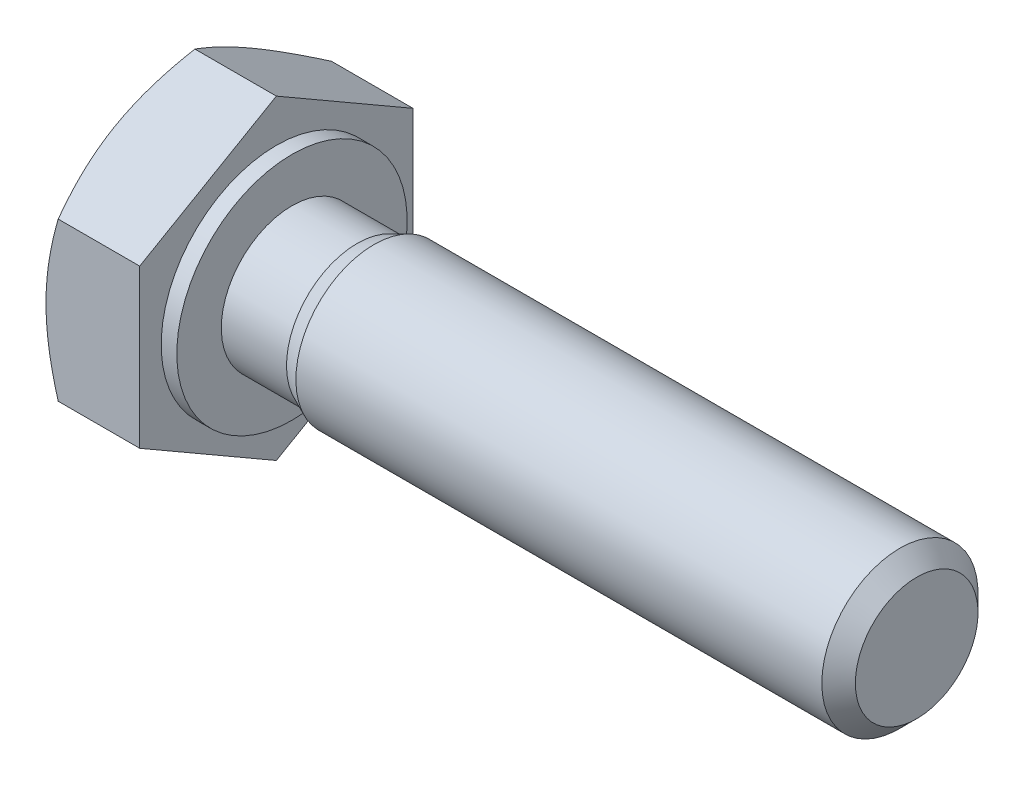
ISO-10303-21;
HEADER;
FILE_DESCRIPTION(('STEP AP214'),'2;1');
FILE_NAME('part.step','',(''),(''),'','','');
FILE_SCHEMA(('AUTOMOTIVE_DESIGN { 1 0 10303 214 1 1 1 1 }'));
ENDSEC;
DATA;
#1=APPLICATION_CONTEXT('core data for automotive mechanical design processes');
#2=APPLICATION_PROTOCOL_DEFINITION('international standard','automotive_design',2000,#1);
#3=PRODUCT_CONTEXT('',#1,'mechanical');
#4=PRODUCT('Part','Part','',(#3));
#5=PRODUCT_RELATED_PRODUCT_CATEGORY('part','',(#4));
#6=PRODUCT_DEFINITION_FORMATION('','',#4);
#7=PRODUCT_DEFINITION_CONTEXT('part definition',#1,'design');
#8=PRODUCT_DEFINITION('design','',#6,#7);
#9=PRODUCT_DEFINITION_SHAPE('','',#8);
#10=(LENGTH_UNIT() NAMED_UNIT(*) SI_UNIT(.MILLI.,.METRE.));
#11=(NAMED_UNIT(*) PLANE_ANGLE_UNIT() SI_UNIT($,.RADIAN.));
#12=(NAMED_UNIT(*) SI_UNIT($,.STERADIAN.) SOLID_ANGLE_UNIT());
#13=UNCERTAINTY_MEASURE_WITH_UNIT(LENGTH_MEASURE(1.E-05),#10,'distance_accuracy_value','');
#14=(GEOMETRIC_REPRESENTATION_CONTEXT(3) GLOBAL_UNCERTAINTY_ASSIGNED_CONTEXT((#13)) GLOBAL_UNIT_ASSIGNED_CONTEXT((#10,
#11,#12)) REPRESENTATION_CONTEXT('',''));
#15=CARTESIAN_POINT('',(0.,0.,0.));
#16=DIRECTION('',(0.,0.,1.));
#17=DIRECTION('',(1.,0.,0.));
#18=AXIS2_PLACEMENT_3D('',#15,#16,#17);
#19=CARTESIAN_POINT('',(-2.80009999999999,0.,0.));
#20=DIRECTION('',(1.,0.,0.));
#21=DIRECTION('',(0.,1.,0.));
#22=AXIS2_PLACEMENT_3D('',#19,#20,#21);
#23=PLANE('',#22);
#24=CARTESIAN_POINT('',(-2.80010000001698,0.,0.));
#25=DIRECTION('',(1.,0.,0.));
#26=DIRECTION('',(0.,0.,-1.));
#27=AXIS2_PLACEMENT_3D('',#24,#25,#26);
#28=CIRCLE('',#27,3.49999999997408);
#29=CARTESIAN_POINT('',(-2.8001000000095,3.03108891323431,-1.74999999999352));
#30=VERTEX_POINT('',#29);
#31=CARTESIAN_POINT('',(-2.8001000000095,3.03108891323431,1.74999999999352));
#32=VERTEX_POINT('',#31);
#33=EDGE_CURVE('E372',#30,#32,#28,.T.);
#34=ORIENTED_EDGE('',*,*,#33,.F.);
#35=CARTESIAN_POINT('',(-2.80010000001698,0.,0.));
#36=DIRECTION('',(1.,0.,0.));
#37=DIRECTION('',(0.,0.,-1.));
#38=AXIS2_PLACEMENT_3D('',#35,#36,#37);
#39=CIRCLE('',#38,3.49999999997408);
#40=CARTESIAN_POINT('',(-2.8001000000095,0.,-3.49999999998704));
#41=VERTEX_POINT('',#40);
#42=EDGE_CURVE('E368',#41,#30,#39,.T.);
#43=ORIENTED_EDGE('',*,*,#42,.F.);
#44=CARTESIAN_POINT('',(-2.80010000001698,0.,0.));
#45=DIRECTION('',(1.,0.,0.));
#46=DIRECTION('',(0.,0.,-1.));
#47=AXIS2_PLACEMENT_3D('',#44,#45,#46);
#48=CIRCLE('',#47,3.49999999997408);
#49=CARTESIAN_POINT('',(-2.8001000000095,-3.03108891323431,-1.74999999999352));
#50=VERTEX_POINT('',#49);
#51=EDGE_CURVE('E364',#50,#41,#48,.T.);
#52=ORIENTED_EDGE('',*,*,#51,.F.);
#53=CARTESIAN_POINT('',(-2.80010000001698,0.,0.));
#54=DIRECTION('',(1.,0.,0.));
#55=DIRECTION('',(0.,0.,-1.));
#56=AXIS2_PLACEMENT_3D('',#53,#54,#55);
#57=CIRCLE('',#56,3.49999999997408);
#58=CARTESIAN_POINT('',(-2.8001000000095,-3.03108891323431,1.74999999999352));
#59=VERTEX_POINT('',#58);
#60=EDGE_CURVE('E91',#59,#50,#57,.T.);
#61=ORIENTED_EDGE('',*,*,#60,.F.);
#62=CARTESIAN_POINT('',(-2.80010000001698,0.,0.));
#63=DIRECTION('',(1.,0.,0.));
#64=DIRECTION('',(0.,0.,-1.));
#65=AXIS2_PLACEMENT_3D('',#62,#63,#64);
#66=CIRCLE('',#65,3.49999999997408);
#67=CARTESIAN_POINT('',(-2.8001000000095,0.,3.49999999998704));
#68=VERTEX_POINT('',#67);
#69=EDGE_CURVE('E88',#68,#59,#66,.T.);
#70=ORIENTED_EDGE('',*,*,#69,.F.);
#71=CARTESIAN_POINT('',(-2.80010000001698,0.,0.));
#72=DIRECTION('',(1.,0.,0.));
#73=DIRECTION('',(0.,0.,-1.));
#74=AXIS2_PLACEMENT_3D('',#71,#72,#73);
#75=CIRCLE('',#74,3.49999999997408);
#76=EDGE_CURVE('E20',#32,#68,#75,.T.);
#77=ORIENTED_EDGE('',*,*,#76,.F.);
#78=EDGE_LOOP('',(#34,#43,#52,#61,#70,#77));
#79=FACE_BOUND('',#78,.T.);
#80=ADVANCED_FACE('F17',(#79),#23,.F.);
#81=CARTESIAN_POINT('',(-2.48561696463412,0.,0.));
#82=DIRECTION('',(1.,0.,0.));
#83=DIRECTION('',(0.,0.,-1.));
#84=AXIS2_PLACEMENT_3D('',#81,#82,#83);
#85=CONICAL_SURFACE('',#84,4.04470059538653,1.04719755120523);
#86=ORIENTED_EDGE('',*,*,#76,.T.);
#87=CARTESIAN_POINT('',(-2.48749260883797,2.02072594216586,3.5));
#88=CARTESIAN_POINT('',(-2.53498760588299,1.85623971145421,3.5));
#89=CARTESIAN_POINT('',(-2.57850131522338,1.69043621589809,3.5));
#90=CARTESIAN_POINT('',(-2.65523695818825,1.35736768336483,3.5));
#91=CARTESIAN_POINT('',(-2.68850978240536,1.19011426411847,3.5));
#92=CARTESIAN_POINT('',(-2.72936316154827,0.937655668885754,3.5));
#93=CARTESIAN_POINT('',(-2.74147660437875,0.853183894577956,3.5));
#94=CARTESIAN_POINT('',(-2.7624452264286,0.683835945146513,3.5));
#95=CARTESIAN_POINT('',(-2.77130049140569,0.598959780726294,3.5));
#96=CARTESIAN_POINT('',(-2.78559717089421,0.428489104641917,3.5));
#97=CARTESIAN_POINT('',(-2.7910212245218,0.342893125795462,3.5));
#98=CARTESIAN_POINT('',(-2.79828014667388,0.171532828534741,3.5));
#99=CARTESIAN_POINT('',(-2.80011430437159,0.0857684801466129,3.5));
#100=CARTESIAN_POINT('',(-2.80010000000202,0.,3.5));
#101=B_SPLINE_CURVE_WITH_KNOTS('',3,(#87,#88,#89,#90,#91,#92,#93,#94,#95,#96,#97,#98,#99,#100),
.UNSPECIFIED.,.F.,.F.,(4,2,2,2,2,2,4),(0.,0.513825660873702,1.02505510269113,1.28100524354765,
1.53694864711989,1.79417690106573,2.05145608301609),.UNSPECIFIED.);
#102=CARTESIAN_POINT('',(-2.48749260883797,2.02072594216422,3.50000000000095));
#103=VERTEX_POINT('',#102);
#104=EDGE_CURVE('E109',#103,#68,#101,.T.);
#105=ORIENTED_EDGE('',*,*,#104,.F.);
#106=CARTESIAN_POINT('',(-2.80010000000202,3.03108891324553,1.75));
#107=CARTESIAN_POINT('',(-2.80011430437159,2.98820467317223,1.82427768265095));
#108=CARTESIAN_POINT('',(-2.79828014667388,2.94532249897816,1.89855178709409));
#109=CARTESIAN_POINT('',(-2.7910212245218,2.8596423503478,2.04695415772193));
#110=CARTESIAN_POINT('',(-2.78559717089421,2.81684436092457,2.12108244986476));
#111=CARTESIAN_POINT('',(-2.77130049140569,2.73160902288238,2.26871438595414));
#112=CARTESIAN_POINT('',(-2.7624452264286,2.68917094067227,2.34221930051783));
#113=CARTESIAN_POINT('',(-2.74147660437875,2.60449696595655,2.48887892680427));
#114=CARTESIAN_POINT('',(-2.72936316154827,2.56226107880265,2.56203362925757));
#115=CARTESIAN_POINT('',(-2.68850978240536,2.43603178118629,2.78066918613283));
#116=CARTESIAN_POINT('',(-2.65523695818825,2.3524050715631,2.92551489607));
#117=CARTESIAN_POINT('',(-2.57850131522337,2.18587080529647,3.213960706445));
#118=CARTESIAN_POINT('',(-2.53498760588299,2.10296905751841,3.35755074563286));
#119=CARTESIAN_POINT('',(-2.48749260883797,2.02072594216258,3.50000000000191));
#120=B_SPLINE_CURVE_WITH_KNOTS('',3,(#106,#107,#108,#109,#110,#111,#112,#113,#114,#115,#116,
#117,#118,#119),.UNSPECIFIED.,.F.,.F.,(4,2,2,2,2,2,4),(0.,0.257279181950367,0.514507435896208,
0.770450839468459,1.02640098032498,1.53763042214241,2.05145608301612),.UNSPECIFIED.);
#121=EDGE_CURVE('E103',#32,#103,#120,.T.);
#122=ORIENTED_EDGE('',*,*,#121,.F.);
#123=EDGE_LOOP('',(#86,#105,#122));
#124=FACE_BOUND('',#123,.T.);
#125=ADVANCED_FACE('F108',(#124),#85,.T.);
#126=CARTESIAN_POINT('',(-2.48561696463412,0.,0.));
#127=DIRECTION('',(1.,0.,0.));
#128=DIRECTION('',(0.,0.,-1.));
#129=AXIS2_PLACEMENT_3D('',#126,#127,#128);
#130=CONICAL_SURFACE('',#129,4.04470059538653,1.04719755120523);
#131=CARTESIAN_POINT('',(-2.80010000000202,0.,3.5));
#132=CARTESIAN_POINT('',(-2.80011430437159,-0.085768480146616,3.5));
#133=CARTESIAN_POINT('',(-2.79828014667387,-0.171532828534744,3.5));
#134=CARTESIAN_POINT('',(-2.7910212245218,-0.342893125795465,3.5));
#135=CARTESIAN_POINT('',(-2.78559717089421,-0.42848910464192,3.5));
#136=CARTESIAN_POINT('',(-2.77130049140569,-0.598959780726298,3.5));
#137=CARTESIAN_POINT('',(-2.7624452264286,-0.683835945146517,3.5));
#138=CARTESIAN_POINT('',(-2.74147660437875,-0.85318389457796,3.5));
#139=CARTESIAN_POINT('',(-2.72936316154827,-0.937655668885758,3.5));
#140=CARTESIAN_POINT('',(-2.68850978240536,-1.19011426411847,3.5));
#141=CARTESIAN_POINT('',(-2.65523695818825,-1.35736768336484,3.5));
#142=CARTESIAN_POINT('',(-2.57850131522338,-1.69043621589809,3.5));
#143=CARTESIAN_POINT('',(-2.53498760588299,-1.85623971145421,3.5));
#144=CARTESIAN_POINT('',(-2.48749260883797,-2.02072594216587,3.5));
#145=B_SPLINE_CURVE_WITH_KNOTS('',3,(#131,#132,#133,#134,#135,#136,#137,#138,#139,#140,#141,
#142,#143,#144),.UNSPECIFIED.,.F.,.F.,(4,2,2,2,2,2,4),(0.,0.257279181950363,0.5145074358962,
0.770450839468448,1.02640098032496,1.53763042214239,2.0514560830161),.UNSPECIFIED.);
#146=CARTESIAN_POINT('',(-2.48749260883797,-2.02072594216423,3.50000000000095));
#147=VERTEX_POINT('',#146);
#148=EDGE_CURVE('E96',#68,#147,#145,.T.);
#149=ORIENTED_EDGE('',*,*,#148,.F.);
#150=ORIENTED_EDGE('',*,*,#69,.T.);
#151=CARTESIAN_POINT('',(-2.48749260883796,-2.02072594216259,3.50000000000191));
#152=CARTESIAN_POINT('',(-2.53498760588298,-2.10296905751842,3.35755074563287));
#153=CARTESIAN_POINT('',(-2.57850131522337,-2.18587080529648,3.21396070644501));
#154=CARTESIAN_POINT('',(-2.65523695818825,-2.35240507156311,2.92551489607));
#155=CARTESIAN_POINT('',(-2.68850978240535,-2.43603178118629,2.78066918613284));
#156=CARTESIAN_POINT('',(-2.72936316154827,-2.56226107880265,2.56203362925757));
#157=CARTESIAN_POINT('',(-2.74147660437875,-2.60449696595655,2.48887892680427));
#158=CARTESIAN_POINT('',(-2.7624452264286,-2.68917094067227,2.34221930051784));
#159=CARTESIAN_POINT('',(-2.77130049140569,-2.73160902288238,2.26871438595414));
#160=CARTESIAN_POINT('',(-2.78559717089421,-2.81684436092457,2.12108244986476));
#161=CARTESIAN_POINT('',(-2.7910212245218,-2.8596423503478,2.04695415772193));
#162=CARTESIAN_POINT('',(-2.79828014667387,-2.94532249897816,1.89855178709409));
#163=CARTESIAN_POINT('',(-2.80011430437159,-2.98820467317223,1.82427768265095));
#164=CARTESIAN_POINT('',(-2.80010000000201,-3.03108891324553,1.75));
#165=B_SPLINE_CURVE_WITH_KNOTS('',3,(#151,#152,#153,#154,#155,#156,#157,#158,#159,#160,#161,
#162,#163,#164),.UNSPECIFIED.,.F.,.F.,(4,2,2,2,2,2,4),(0.,0.513825660873709,1.02505510269114,
1.28100524354766,1.53694864711991,1.79417690106576,2.05145608301612),.UNSPECIFIED.);
#166=EDGE_CURVE('E98',#147,#59,#165,.T.);
#167=ORIENTED_EDGE('',*,*,#166,.F.);
#168=EDGE_LOOP('',(#149,#150,#167));
#169=FACE_BOUND('',#168,.T.);
#170=ADVANCED_FACE('F97',(#169),#130,.T.);
#171=CARTESIAN_POINT('',(-2.48561696463412,0.,0.));
#172=DIRECTION('',(1.,0.,0.));
#173=DIRECTION('',(0.,0.,-1.));
#174=AXIS2_PLACEMENT_3D('',#171,#172,#173);
#175=CONICAL_SURFACE('',#174,4.04470059538653,1.04719755120523);
#176=CARTESIAN_POINT('',(-2.80010000000201,-3.03108891324553,1.75));
#177=CARTESIAN_POINT('',(-2.80011430437159,-3.07397315331884,1.67572231734905));
#178=CARTESIAN_POINT('',(-2.79828014667387,-3.11685532751291,1.60144821290592));
#179=CARTESIAN_POINT('',(-2.7910212245218,-3.20253547614327,1.45304584227808));
#180=CARTESIAN_POINT('',(-2.78559717089421,-3.24533346556649,1.37891755013525));
#181=CARTESIAN_POINT('',(-2.77130049140569,-3.33056880360868,1.23128561404587));
#182=CARTESIAN_POINT('',(-2.7624452264286,-3.37300688581879,1.15778069948218));
#183=CARTESIAN_POINT('',(-2.74147660437875,-3.45768086053451,1.01112107319574));
#184=CARTESIAN_POINT('',(-2.72936316154827,-3.49991674768841,0.937966370742446));
#185=CARTESIAN_POINT('',(-2.68850978240536,-3.62614604530477,0.719330813867181));
#186=CARTESIAN_POINT('',(-2.65523695818825,-3.70977275492795,0.574485103930018));
#187=CARTESIAN_POINT('',(-2.57850131522338,-3.87630702119458,0.286039293555015));
#188=CARTESIAN_POINT('',(-2.53498760588299,-3.95920876897264,0.142449254367156));
#189=CARTESIAN_POINT('',(-2.48749260883797,-4.04145188432847,-1.88510767100038E-12));
#190=B_SPLINE_CURVE_WITH_KNOTS('',3,(#176,#177,#178,#179,#180,#181,#182,#183,#184,#185,#186,
#187,#188,#189),.UNSPECIFIED.,.F.,.F.,(4,2,2,2,2,2,4),(0.,0.257279181950364,0.514507435896202,
0.77045083946845,1.02640098032497,1.5376304221424,2.0514560830161),.UNSPECIFIED.);
#191=CARTESIAN_POINT('',(-2.48749260883797,-4.04145188432847,0.));
#192=VERTEX_POINT('',#191);
#193=EDGE_CURVE('E114',#59,#192,#190,.T.);
#194=ORIENTED_EDGE('',*,*,#193,.F.);
#195=ORIENTED_EDGE('',*,*,#60,.T.);
#196=CARTESIAN_POINT('',(-2.48749260883796,-4.04145188432848,1.90549218164857E-12));
#197=CARTESIAN_POINT('',(-2.53498760588298,-3.95920876897265,-0.142449254367138));
#198=CARTESIAN_POINT('',(-2.57850131522337,-3.87630702119459,-0.286039293554998));
#199=CARTESIAN_POINT('',(-2.65523695818825,-3.70977275492796,-0.574485103930004));
#200=CARTESIAN_POINT('',(-2.68850978240535,-3.62614604530478,-0.719330813867169));
#201=CARTESIAN_POINT('',(-2.72936316154827,-3.49991674768842,-0.937966370742436));
#202=CARTESIAN_POINT('',(-2.74147660437875,-3.45768086053452,-1.01112107319574));
#203=CARTESIAN_POINT('',(-2.7624452264286,-3.3730068858188,-1.15778069948217));
#204=CARTESIAN_POINT('',(-2.77130049140569,-3.33056880360869,-1.23128561404587));
#205=CARTESIAN_POINT('',(-2.78559717089421,-3.2453334655665,-1.37891755013525));
#206=CARTESIAN_POINT('',(-2.7910212245218,-3.20253547614327,-1.45304584227807));
#207=CARTESIAN_POINT('',(-2.79828014667387,-3.11685532751291,-1.60144821290591));
#208=CARTESIAN_POINT('',(-2.80011430437159,-3.07397315331884,-1.67572231734905));
#209=CARTESIAN_POINT('',(-2.80010000000201,-3.03108891324553,-1.75));
#210=B_SPLINE_CURVE_WITH_KNOTS('',3,(#196,#197,#198,#199,#200,#201,#202,#203,#204,#205,#206,
#207,#208,#209),.UNSPECIFIED.,.F.,.F.,(4,2,2,2,2,2,4),(0.,0.51382566087371,1.02505510269115,
1.28100524354767,1.53694864711992,1.79417690106576,2.05145608301613),.UNSPECIFIED.);
#211=EDGE_CURVE('E208',#192,#50,#210,.T.);
#212=ORIENTED_EDGE('',*,*,#211,.F.);
#213=EDGE_LOOP('',(#194,#195,#212));
#214=FACE_BOUND('',#213,.T.);
#215=ADVANCED_FACE('F216',(#214),#175,.T.);
#216=CARTESIAN_POINT('',(-2.48561696463412,0.,0.));
#217=DIRECTION('',(1.,0.,0.));
#218=DIRECTION('',(0.,0.,-1.));
#219=AXIS2_PLACEMENT_3D('',#216,#217,#218);
#220=CONICAL_SURFACE('',#219,4.04470059538653,1.04719755120523);
#221=CARTESIAN_POINT('',(-2.80010000000201,-3.03108891324553,-1.75));
#222=CARTESIAN_POINT('',(-2.80011430437159,-2.98820467317223,-1.82427768265095));
#223=CARTESIAN_POINT('',(-2.79828014667387,-2.94532249897816,-1.89855178709409));
#224=CARTESIAN_POINT('',(-2.7910212245218,-2.8596423503478,-2.04695415772193));
#225=CARTESIAN_POINT('',(-2.78559717089421,-2.81684436092458,-2.12108244986475));
#226=CARTESIAN_POINT('',(-2.77130049140569,-2.73160902288239,-2.26871438595413));
#227=CARTESIAN_POINT('',(-2.7624452264286,-2.68917094067228,-2.34221930051783));
#228=CARTESIAN_POINT('',(-2.74147660437875,-2.60449696595655,-2.48887892680426));
#229=CARTESIAN_POINT('',(-2.72936316154827,-2.56226107880266,-2.56203362925756));
#230=CARTESIAN_POINT('',(-2.68850978240536,-2.4360317811863,-2.78066918613282));
#231=CARTESIAN_POINT('',(-2.65523695818825,-2.35240507156312,-2.92551489606998));
#232=CARTESIAN_POINT('',(-2.57850131522338,-2.18587080529649,-3.21396070644498));
#233=CARTESIAN_POINT('',(-2.53498760588299,-2.10296905751843,-3.35755074563284));
#234=CARTESIAN_POINT('',(-2.48749260883797,-2.0207259421626,-3.50000000000188));
#235=B_SPLINE_CURVE_WITH_KNOTS('',3,(#221,#222,#223,#224,#225,#226,#227,#228,#229,#230,#231,
#232,#233,#234),.UNSPECIFIED.,.F.,.F.,(4,2,2,2,2,2,4),(0.,0.257279181950364,0.5145074358962,
0.770450839468447,1.02640098032496,1.53763042214239,2.05145608301609),.UNSPECIFIED.);
#236=CARTESIAN_POINT('',(-2.48749260883797,-2.02072594216425,-3.50000000000094));
#237=VERTEX_POINT('',#236);
#238=EDGE_CURVE('E220',#50,#237,#235,.T.);
#239=ORIENTED_EDGE('',*,*,#238,.F.);
#240=ORIENTED_EDGE('',*,*,#51,.T.);
#241=CARTESIAN_POINT('',(-2.48749260883796,-2.02072594216589,-3.5));
#242=CARTESIAN_POINT('',(-2.53498760588298,-1.85623971145424,-3.5));
#243=CARTESIAN_POINT('',(-2.57850131522337,-1.69043621589812,-3.5));
#244=CARTESIAN_POINT('',(-2.65523695818825,-1.35736768336486,-3.5));
#245=CARTESIAN_POINT('',(-2.68850978240536,-1.19011426411849,-3.5));
#246=CARTESIAN_POINT('',(-2.72936316154827,-0.937655668885769,-3.5));
#247=CARTESIAN_POINT('',(-2.74147660437875,-0.853183894577971,-3.5));
#248=CARTESIAN_POINT('',(-2.7624452264286,-0.683835945146524,-3.5));
#249=CARTESIAN_POINT('',(-2.77130049140569,-0.598959780726304,-3.5));
#250=CARTESIAN_POINT('',(-2.78559717089421,-0.428489104641924,-3.5));
#251=CARTESIAN_POINT('',(-2.7910212245218,-0.342893125795468,-3.5));
#252=CARTESIAN_POINT('',(-2.79828014667387,-0.171532828534745,-3.5));
#253=CARTESIAN_POINT('',(-2.80011430437159,-0.085768480146615,-3.5));
#254=CARTESIAN_POINT('',(-2.80010000000201,0.,-3.5));
#255=B_SPLINE_CURVE_WITH_KNOTS('',3,(#241,#242,#243,#244,#245,#246,#247,#248,#249,#250,#251,
#252,#253,#254),.UNSPECIFIED.,.F.,.F.,(4,2,2,2,2,2,4),(0.,0.51382566087371,1.02505510269115,
1.28100524354767,1.53694864711992,1.79417690106576,2.05145608301613),.UNSPECIFIED.);
#256=EDGE_CURVE('E202',#237,#41,#255,.T.);
#257=ORIENTED_EDGE('',*,*,#256,.F.);
#258=EDGE_LOOP('',(#239,#240,#257));
#259=FACE_BOUND('',#258,.T.);
#260=ADVANCED_FACE('F213',(#259),#220,.T.);
#261=CARTESIAN_POINT('',(-2.48561696463412,0.,0.));
#262=DIRECTION('',(1.,0.,0.));
#263=DIRECTION('',(0.,0.,-1.));
#264=AXIS2_PLACEMENT_3D('',#261,#262,#263);
#265=CONICAL_SURFACE('',#264,4.04470059538653,1.04719755120523);
#266=ORIENTED_EDGE('',*,*,#42,.T.);
#267=CARTESIAN_POINT('',(-2.48749260883796,2.02072594216259,-3.50000000000191));
#268=CARTESIAN_POINT('',(-2.53498760588298,2.10296905751842,-3.35755074563287));
#269=CARTESIAN_POINT('',(-2.57850131522337,2.18587080529648,-3.21396070644501));
#270=CARTESIAN_POINT('',(-2.65523695818825,2.3524050715631,-2.92551489607));
#271=CARTESIAN_POINT('',(-2.68850978240535,2.43603178118629,-2.78066918613283));
#272=CARTESIAN_POINT('',(-2.72936316154827,2.56226107880265,-2.56203362925757));
#273=CARTESIAN_POINT('',(-2.74147660437875,2.60449696595655,-2.48887892680427));
#274=CARTESIAN_POINT('',(-2.7624452264286,2.68917094067227,-2.34221930051783));
#275=CARTESIAN_POINT('',(-2.77130049140569,2.73160902288238,-2.26871438595414));
#276=CARTESIAN_POINT('',(-2.78559717089421,2.81684436092457,-2.12108244986476));
#277=CARTESIAN_POINT('',(-2.7910212245218,2.8596423503478,-2.04695415772193));
#278=CARTESIAN_POINT('',(-2.79828014667387,2.94532249897816,-1.89855178709409));
#279=CARTESIAN_POINT('',(-2.80011430437159,2.98820467317222,-1.82427768265095));
#280=CARTESIAN_POINT('',(-2.80010000000202,3.03108891324553,-1.75));
#281=B_SPLINE_CURVE_WITH_KNOTS('',3,(#267,#268,#269,#270,#271,#272,#273,#274,#275,#276,#277,
#278,#279,#280),.UNSPECIFIED.,.F.,.F.,(4,2,2,2,2,2,4),(0.,0.513825660873709,1.02505510269114,
1.28100524354766,1.53694864711992,1.79417690106576,2.05145608301612),.UNSPECIFIED.);
#282=CARTESIAN_POINT('',(-2.48749260883797,2.02072594216423,-3.50000000000095));
#283=VERTEX_POINT('',#282);
#284=EDGE_CURVE('E174',#283,#30,#281,.T.);
#285=ORIENTED_EDGE('',*,*,#284,.F.);
#286=CARTESIAN_POINT('',(-2.80010000000201,0.,-3.5));
#287=CARTESIAN_POINT('',(-2.80011430437159,0.0857684801466146,-3.5));
#288=CARTESIAN_POINT('',(-2.79828014667387,0.171532828534743,-3.5));
#289=CARTESIAN_POINT('',(-2.7910212245218,0.342893125795464,-3.5));
#290=CARTESIAN_POINT('',(-2.78559717089421,0.428489104641919,-3.5));
#291=CARTESIAN_POINT('',(-2.77130049140569,0.598959780726297,-3.5));
#292=CARTESIAN_POINT('',(-2.7624452264286,0.683835945146516,-3.5));
#293=CARTESIAN_POINT('',(-2.74147660437875,0.85318389457796,-3.5));
#294=CARTESIAN_POINT('',(-2.72936316154827,0.937655668885757,-3.5));
#295=CARTESIAN_POINT('',(-2.68850978240536,1.19011426411847,-3.5));
#296=CARTESIAN_POINT('',(-2.65523695818825,1.35736768336484,-3.5));
#297=CARTESIAN_POINT('',(-2.57850131522338,1.69043621589809,-3.5));
#298=CARTESIAN_POINT('',(-2.53498760588299,1.85623971145421,-3.5));
#299=CARTESIAN_POINT('',(-2.48749260883797,2.02072594216587,-3.5));
#300=B_SPLINE_CURVE_WITH_KNOTS('',3,(#286,#287,#288,#289,#290,#291,#292,#293,#294,#295,#296,
#297,#298,#299),.UNSPECIFIED.,.F.,.F.,(4,2,2,2,2,2,4),(0.,0.257279181950364,0.514507435896201,
0.770450839468448,1.02640098032496,1.53763042214239,2.0514560830161),.UNSPECIFIED.);
#301=EDGE_CURVE('E197',#41,#283,#300,.T.);
#302=ORIENTED_EDGE('',*,*,#301,.F.);
#303=EDGE_LOOP('',(#266,#285,#302));
#304=FACE_BOUND('',#303,.T.);
#305=ADVANCED_FACE('F159',(#304),#265,.T.);
#306=CARTESIAN_POINT('',(-2.48561696463412,0.,0.));
#307=DIRECTION('',(1.,0.,0.));
#308=DIRECTION('',(0.,0.,-1.));
#309=AXIS2_PLACEMENT_3D('',#306,#307,#308);
#310=CONICAL_SURFACE('',#309,4.04470059538653,1.04719755120523);
#311=ORIENTED_EDGE('',*,*,#33,.T.);
#312=CARTESIAN_POINT('',(-2.48749260883797,4.04145188432848,-1.89469704332326E-12));
#313=CARTESIAN_POINT('',(-2.53498760588299,3.95920876897265,0.142449254367147));
#314=CARTESIAN_POINT('',(-2.57850131522337,3.87630702119459,0.286039293555007));
#315=CARTESIAN_POINT('',(-2.65523695818825,3.70977275492796,0.57448510393001));
#316=CARTESIAN_POINT('',(-2.68850978240536,3.62614604530477,0.719330813867175));
#317=CARTESIAN_POINT('',(-2.72936316154827,3.49991674768842,0.93796637074244));
#318=CARTESIAN_POINT('',(-2.74147660437875,3.45768086053452,1.01112107319574));
#319=CARTESIAN_POINT('',(-2.7624452264286,3.37300688581879,1.15778069948217));
#320=CARTESIAN_POINT('',(-2.77130049140569,3.33056880360868,1.23128561404587));
#321=CARTESIAN_POINT('',(-2.78559717089421,3.24533346556649,1.37891755013525));
#322=CARTESIAN_POINT('',(-2.7910212245218,3.20253547614327,1.45304584227807));
#323=CARTESIAN_POINT('',(-2.79828014667387,3.11685532751291,1.60144821290591));
#324=CARTESIAN_POINT('',(-2.80011430437159,3.07397315331884,1.67572231734905));
#325=CARTESIAN_POINT('',(-2.80010000000202,3.03108891324553,1.75));
#326=B_SPLINE_CURVE_WITH_KNOTS('',3,(#312,#313,#314,#315,#316,#317,#318,#319,#320,#321,#322,
#323,#324,#325),.UNSPECIFIED.,.F.,.F.,(4,2,2,2,2,2,4),(0.,0.513825660873707,1.02505510269114,
1.28100524354766,1.53694864711991,1.79417690106575,2.05145608301611),.UNSPECIFIED.);
#327=CARTESIAN_POINT('',(-2.48749260883829,4.04145188432793,-9.51148669664066E-13));
#328=VERTEX_POINT('',#327);
#329=EDGE_CURVE('E144',#328,#32,#326,.T.);
#330=ORIENTED_EDGE('',*,*,#329,.F.);
#331=CARTESIAN_POINT('',(-2.80010000000201,3.03108891324553,-1.75));
#332=CARTESIAN_POINT('',(-2.80011430437159,3.07397315331884,-1.67572231734905));
#333=CARTESIAN_POINT('',(-2.79828014667388,3.11685532751291,-1.60144821290591));
#334=CARTESIAN_POINT('',(-2.7910212245218,3.20253547614327,-1.45304584227807));
#335=CARTESIAN_POINT('',(-2.78559717089421,3.24533346556649,-1.37891755013525));
#336=CARTESIAN_POINT('',(-2.77130049140569,3.33056880360868,-1.23128561404587));
#337=CARTESIAN_POINT('',(-2.7624452264286,3.37300688581879,-1.15778069948217));
#338=CARTESIAN_POINT('',(-2.74147660437875,3.45768086053452,-1.01112107319574));
#339=CARTESIAN_POINT('',(-2.72936316154827,3.49991674768841,-0.937966370742441));
#340=CARTESIAN_POINT('',(-2.68850978240536,3.62614604530477,-0.719330813867175));
#341=CARTESIAN_POINT('',(-2.65523695818825,3.70977275492796,-0.574485103930011));
#342=CARTESIAN_POINT('',(-2.57850131522337,3.87630702119459,-0.286039293555007));
#343=CARTESIAN_POINT('',(-2.53498760588299,3.95920876897264,-0.142449254367147));
#344=CARTESIAN_POINT('',(-2.48749260883797,4.04145188432847,1.89478551940359E-12));
#345=B_SPLINE_CURVE_WITH_KNOTS('',3,(#331,#332,#333,#334,#335,#336,#337,#338,#339,#340,#341,
#342,#343,#344),.UNSPECIFIED.,.F.,.F.,(4,2,2,2,2,2,4),(0.,0.257279181950366,0.514507435896205,
0.770450839468454,1.02640098032497,1.53763042214241,2.05145608301611),.UNSPECIFIED.);
#346=EDGE_CURVE('E165',#30,#328,#345,.T.);
#347=ORIENTED_EDGE('',*,*,#346,.F.);
#348=EDGE_LOOP('',(#311,#330,#347));
#349=FACE_BOUND('',#348,.T.);
#350=ADVANCED_FACE('F153',(#349),#310,.T.);
#351=CARTESIAN_POINT('',(-0.400099999999994,4.04145188432738,0.));
#352=DIRECTION('',(0.,0.866025403784438,0.500000000000001));
#353=DIRECTION('',(0.,-0.500000000000001,0.866025403784438));
#354=AXIS2_PLACEMENT_3D('',#351,#352,#353);
#355=PLANE('',#354);
#356=DIRECTION('',(0.,-0.5,0.866025403784438));
#357=VECTOR('',#356,1.);
#358=CARTESIAN_POINT('',(-0.400099999999994,4.04145188432738,0.));
#359=LINE('',#358,#357);
#360=CARTESIAN_POINT('',(-0.400099999999994,4.04145188432738,0.));
#361=VERTEX_POINT('',#360);
#362=CARTESIAN_POINT('',(-0.400099999999993,2.02072594216369,3.5));
#363=VERTEX_POINT('',#362);
#364=EDGE_CURVE('E296',#361,#363,#359,.T.);
#365=ORIENTED_EDGE('',*,*,#364,.F.);
#366=DIRECTION('',(1.,0.,0.));
#367=VECTOR('',#366,1.);
#368=CARTESIAN_POINT('',(-0.400099999999994,4.04145188432738,0.));
#369=LINE('',#368,#367);
#370=EDGE_CURVE('E173',#328,#361,#369,.T.);
#371=ORIENTED_EDGE('',*,*,#370,.F.);
#372=ORIENTED_EDGE('',*,*,#329,.T.);
#373=ORIENTED_EDGE('',*,*,#121,.T.);
#374=DIRECTION('',(1.,0.,0.));
#375=VECTOR('',#374,1.);
#376=CARTESIAN_POINT('',(-0.400099999999994,2.02072594216369,3.5));
#377=LINE('',#376,#375);
#378=EDGE_CURVE('E102',#363,#103,#377,.F.);
#379=ORIENTED_EDGE('',*,*,#378,.F.);
#380=EDGE_LOOP('',(#365,#371,#372,#373,#379));
#381=FACE_BOUND('',#380,.T.);
#382=ADVANCED_FACE('F150',(#381),#355,.T.);
#383=CARTESIAN_POINT('',(-0.400099999999994,2.02072594216369,3.5));
#384=DIRECTION('',(0.,0.,1.));
#385=DIRECTION('',(0.,-1.,0.));
#386=AXIS2_PLACEMENT_3D('',#383,#384,#385);
#387=PLANE('',#386);
#388=ORIENTED_EDGE('',*,*,#378,.T.);
#389=ORIENTED_EDGE('',*,*,#104,.T.);
#390=ORIENTED_EDGE('',*,*,#148,.T.);
#391=DIRECTION('',(1.,0.,0.));
#392=VECTOR('',#391,1.);
#393=CARTESIAN_POINT('',(-0.400099999999993,-2.02072594216369,3.5));
#394=LINE('',#393,#392);
#395=CARTESIAN_POINT('',(-0.400099999999993,-2.02072594216369,3.5));
#396=VERTEX_POINT('',#395);
#397=EDGE_CURVE('E116',#396,#147,#394,.F.);
#398=ORIENTED_EDGE('',*,*,#397,.F.);
#399=DIRECTION('',(0.,1.,0.));
#400=VECTOR('',#399,1.);
#401=CARTESIAN_POINT('',(-0.400099999999993,0.,3.5));
#402=LINE('',#401,#400);
#403=EDGE_CURVE('E292',#363,#396,#402,.F.);
#404=ORIENTED_EDGE('',*,*,#403,.F.);
#405=EDGE_LOOP('',(#388,#389,#390,#398,#404));
#406=FACE_BOUND('',#405,.T.);
#407=ADVANCED_FACE('F112',(#406),#387,.T.);
#408=CARTESIAN_POINT('',(-0.400099999999993,-2.02072594216369,3.5));
#409=DIRECTION('',(0.,-0.866025403784439,0.5));
#410=DIRECTION('',(0.,-0.5,-0.866025403784439));
#411=AXIS2_PLACEMENT_3D('',#408,#409,#410);
#412=PLANE('',#411);
#413=ORIENTED_EDGE('',*,*,#397,.T.);
#414=ORIENTED_EDGE('',*,*,#166,.T.);
#415=ORIENTED_EDGE('',*,*,#193,.T.);
#416=DIRECTION('',(1.,0.,0.));
#417=VECTOR('',#416,1.);
#418=CARTESIAN_POINT('',(-0.400099999999993,-4.04145188432738,0.));
#419=LINE('',#418,#417);
#420=CARTESIAN_POINT('',(-0.400099999999993,-4.04145188432738,0.));
#421=VERTEX_POINT('',#420);
#422=EDGE_CURVE('E225',#421,#192,#419,.F.);
#423=ORIENTED_EDGE('',*,*,#422,.F.);
#424=DIRECTION('',(0.,-0.5,-0.866025403784439));
#425=VECTOR('',#424,1.);
#426=CARTESIAN_POINT('',(-0.400099999999993,-2.02072594216369,3.5));
#427=LINE('',#426,#425);
#428=EDGE_CURVE('E295',#396,#421,#427,.T.);
#429=ORIENTED_EDGE('',*,*,#428,.F.);
#430=EDGE_LOOP('',(#413,#414,#415,#423,#429));
#431=FACE_BOUND('',#430,.T.);
#432=ADVANCED_FACE('F229',(#431),#412,.T.);
#433=CARTESIAN_POINT('',(-0.400099999999993,-4.04145188432738,0.));
#434=DIRECTION('',(0.,-0.866025403784438,-0.5));
#435=DIRECTION('',(0.,0.5,-0.866025403784438));
#436=AXIS2_PLACEMENT_3D('',#433,#434,#435);
#437=PLANE('',#436);
#438=ORIENTED_EDGE('',*,*,#422,.T.);
#439=ORIENTED_EDGE('',*,*,#211,.T.);
#440=ORIENTED_EDGE('',*,*,#238,.T.);
#441=DIRECTION('',(1.,0.,0.));
#442=VECTOR('',#441,1.);
#443=CARTESIAN_POINT('',(-0.400099999999993,-2.02072594216369,-3.5));
#444=LINE('',#443,#442);
#445=CARTESIAN_POINT('',(-0.400099999999993,-2.02072594216369,-3.5));
#446=VERTEX_POINT('',#445);
#447=EDGE_CURVE('E330',#446,#237,#444,.F.);
#448=ORIENTED_EDGE('',*,*,#447,.F.);
#449=DIRECTION('',(0.,0.5,-0.866025403784438));
#450=VECTOR('',#449,1.);
#451=CARTESIAN_POINT('',(-0.400099999999992,-4.04145188432738,0.));
#452=LINE('',#451,#450);
#453=EDGE_CURVE('E301',#421,#446,#452,.T.);
#454=ORIENTED_EDGE('',*,*,#453,.F.);
#455=EDGE_LOOP('',(#438,#439,#440,#448,#454));
#456=FACE_BOUND('',#455,.T.);
#457=ADVANCED_FACE('F194',(#456),#437,.T.);
#458=CARTESIAN_POINT('',(-0.400099999999993,-2.02072594216369,-3.5));
#459=DIRECTION('',(0.,0.,-1.));
#460=DIRECTION('',(0.,1.,0.));
#461=AXIS2_PLACEMENT_3D('',#458,#459,#460);
#462=PLANE('',#461);
#463=DIRECTION('',(0.,1.,0.));
#464=VECTOR('',#463,1.);
#465=CARTESIAN_POINT('',(-0.400099999999993,0.,-3.5));
#466=LINE('',#465,#464);
#467=CARTESIAN_POINT('',(-0.400099999999994,2.02072594216369,-3.5));
#468=VERTEX_POINT('',#467);
#469=EDGE_CURVE('E306',#446,#468,#466,.T.);
#470=ORIENTED_EDGE('',*,*,#469,.F.);
#471=ORIENTED_EDGE('',*,*,#447,.T.);
#472=ORIENTED_EDGE('',*,*,#256,.T.);
#473=ORIENTED_EDGE('',*,*,#301,.T.);
#474=DIRECTION('',(1.,0.,0.));
#475=VECTOR('',#474,1.);
#476=CARTESIAN_POINT('',(-0.400099999999994,2.02072594216369,-3.5));
#477=LINE('',#476,#475);
#478=EDGE_CURVE('E35',#468,#283,#477,.F.);
#479=ORIENTED_EDGE('',*,*,#478,.F.);
#480=EDGE_LOOP('',(#470,#471,#472,#473,#479));
#481=FACE_BOUND('',#480,.T.);
#482=ADVANCED_FACE('F187',(#481),#462,.T.);
#483=CARTESIAN_POINT('',(-0.400099999999994,2.02072594216369,-3.5));
#484=DIRECTION('',(0.,0.866025403784439,-0.5));
#485=DIRECTION('',(0.,0.5,0.866025403784439));
#486=AXIS2_PLACEMENT_3D('',#483,#484,#485);
#487=PLANE('',#486);
#488=DIRECTION('',(0.,0.5,0.866025403784439));
#489=VECTOR('',#488,1.);
#490=CARTESIAN_POINT('',(-0.400099999999993,2.02072594216369,-3.5));
#491=LINE('',#490,#489);
#492=EDGE_CURVE('E285',#468,#361,#491,.T.);
#493=ORIENTED_EDGE('',*,*,#492,.F.);
#494=ORIENTED_EDGE('',*,*,#478,.T.);
#495=ORIENTED_EDGE('',*,*,#284,.T.);
#496=ORIENTED_EDGE('',*,*,#346,.T.);
#497=ORIENTED_EDGE('',*,*,#370,.T.);
#498=EDGE_LOOP('',(#493,#494,#495,#496,#497));
#499=FACE_BOUND('',#498,.T.);
#500=ADVANCED_FACE('F181',(#499),#487,.T.);
#501=CARTESIAN_POINT('',(-0.400099999999993,0.,0.));
#502=DIRECTION('',(1.,0.,0.));
#503=DIRECTION('',(0.,1.,0.));
#504=AXIS2_PLACEMENT_3D('',#501,#502,#503);
#505=PLANE('',#504);
#506=CARTESIAN_POINT('',(-0.400099999999994,0.,0.));
#507=DIRECTION('',(1.,0.,0.));
#508=DIRECTION('',(0.,1.,0.));
#509=AXIS2_PLACEMENT_3D('',#506,#507,#508);
#510=CIRCLE('',#509,2.95);
#511=CARTESIAN_POINT('',(-0.400099999999994,2.95,0.));
#512=VERTEX_POINT('',#511);
#513=EDGE_CURVE('E175',#512,#512,#510,.T.);
#514=ORIENTED_EDGE('',*,*,#513,.F.);
#515=EDGE_LOOP('',(#514));
#516=FACE_BOUND('',#515,.T.);
#517=ORIENTED_EDGE('',*,*,#469,.T.);
#518=ORIENTED_EDGE('',*,*,#492,.T.);
#519=ORIENTED_EDGE('',*,*,#364,.T.);
#520=ORIENTED_EDGE('',*,*,#403,.T.);
#521=ORIENTED_EDGE('',*,*,#428,.T.);
#522=ORIENTED_EDGE('',*,*,#453,.T.);
#523=EDGE_LOOP('',(#517,#518,#519,#520,#521,#522));
#524=FACE_BOUND('',#523,.T.);
#525=ADVANCED_FACE('F186',(#516,#524),#505,.T.);
#526=CARTESIAN_POINT('',(-0.200049999999994,0.,0.));
#527=DIRECTION('',(1.,0.,0.));
#528=DIRECTION('',(0.,1.,0.));
#529=AXIS2_PLACEMENT_3D('',#526,#527,#528);
#530=CYLINDRICAL_SURFACE('',#529,2.95);
#531=ORIENTED_EDGE('',*,*,#513,.T.);
#532=EDGE_LOOP('',(#531));
#533=FACE_BOUND('',#532,.T.);
#534=CARTESIAN_POINT('',(0.,0.,0.));
#535=DIRECTION('',(1.,0.,0.));
#536=DIRECTION('',(0.,1.,0.));
#537=AXIS2_PLACEMENT_3D('',#534,#535,#536);
#538=CIRCLE('',#537,2.95);
#539=CARTESIAN_POINT('',(0.,2.95,0.));
#540=VERTEX_POINT('',#539);
#541=EDGE_CURVE('E279',#540,#540,#538,.T.);
#542=ORIENTED_EDGE('',*,*,#541,.F.);
#543=EDGE_LOOP('',(#542));
#544=FACE_BOUND('',#543,.T.);
#545=ADVANCED_FACE('F266',(#533,#544),#530,.T.);
#546=CARTESIAN_POINT('',(0.,2.38027845,0.));
#547=DIRECTION('',(1.,0.,0.));
#548=DIRECTION('',(0.,1.,0.));
#549=AXIS2_PLACEMENT_3D('',#546,#547,#548);
#550=PLANE('',#549);
#551=CARTESIAN_POINT('',(0.,0.,0.));
#552=DIRECTION('',(1.,0.,0.));
#553=DIRECTION('',(0.,1.,0.));
#554=AXIS2_PLACEMENT_3D('',#551,#552,#553);
#555=CIRCLE('',#554,1.8105569);
#556=CARTESIAN_POINT('',(0.,1.8105569,0.));
#557=VERTEX_POINT('',#556);
#558=EDGE_CURVE('E281',#557,#557,#555,.T.);
#559=ORIENTED_EDGE('',*,*,#558,.F.);
#560=EDGE_LOOP('',(#559));
#561=FACE_BOUND('',#560,.T.);
#562=ORIENTED_EDGE('',*,*,#541,.T.);
#563=EDGE_LOOP('',(#562));
#564=FACE_BOUND('',#563,.T.);
#565=ADVANCED_FACE('F263',(#561,#564),#550,.T.);
#566=CARTESIAN_POINT('',(16.,1.,0.));
#567=DIRECTION('',(1.,0.,0.));
#568=DIRECTION('',(0.,1.,0.));
#569=AXIS2_PLACEMENT_3D('',#566,#567,#568);
#570=PLANE('',#569);
#571=CARTESIAN_POINT('',(16.0000000000196,0.,0.));
#572=DIRECTION('',(-1.,0.,0.));
#573=DIRECTION('',(0.,0.,1.));
#574=AXIS2_PLACEMENT_3D('',#571,#572,#573);
#575=CIRCLE('',#574,1.57058499996765);
#576=CARTESIAN_POINT('',(16.0000000000196,0.,1.57058499996765));
#577=VERTEX_POINT('',#576);
#578=EDGE_CURVE('E283',#577,#577,#575,.T.);
#579=ORIENTED_EDGE('',*,*,#578,.F.);
#580=EDGE_LOOP('',(#579));
#581=FACE_BOUND('',#580,.T.);
#582=ADVANCED_FACE('F259',(#581),#570,.T.);
#583=CARTESIAN_POINT('',(0.835242500000006,0.,0.));
#584=DIRECTION('',(1.,0.,0.));
#585=DIRECTION('',(0.,1.,0.));
#586=AXIS2_PLACEMENT_3D('',#583,#584,#585);
#587=CYLINDRICAL_SURFACE('',#586,1.8105569);
#588=ORIENTED_EDGE('',*,*,#558,.T.);
#589=EDGE_LOOP('',(#588));
#590=FACE_BOUND('',#589,.T.);
#591=CARTESIAN_POINT('',(1.67048500003375,0.,0.));
#592=DIRECTION('',(1.,0.,0.));
#593=DIRECTION('',(0.,1.,0.));
#594=AXIS2_PLACEMENT_3D('',#591,#592,#593);
#595=CIRCLE('',#594,1.81055690003973);
#596=CARTESIAN_POINT('',(1.67048500003375,1.81055690003973,0.));
#597=VERTEX_POINT('',#596);
#598=EDGE_CURVE('E289',#597,#597,#595,.T.);
#599=ORIENTED_EDGE('',*,*,#598,.F.);
#600=EDGE_LOOP('',(#599));
#601=FACE_BOUND('',#600,.T.);
#602=ADVANCED_FACE('F255',(#590,#601),#587,.T.);
#603=CARTESIAN_POINT('',(15.570485000012,0.,0.));
#604=DIRECTION('',(-1.,0.,0.));
#605=DIRECTION('',(0.,0.,1.));
#606=AXIS2_PLACEMENT_3D('',#603,#604,#605);
#607=CONICAL_SURFACE('',#606,2.00000000000955,0.785281739515195);
#608=CARTESIAN_POINT('',(15.570485,0.,0.));
#609=DIRECTION('',(1.,0.,0.));
#610=DIRECTION('',(0.,1.,0.));
#611=AXIS2_PLACEMENT_3D('',#608,#609,#610);
#612=CIRCLE('',#611,2.);
#613=CARTESIAN_POINT('',(15.570485,2.,0.));
#614=VERTEX_POINT('',#613);
#615=EDGE_CURVE('E26',#614,#614,#612,.F.);
#616=ORIENTED_EDGE('',*,*,#615,.F.);
#617=EDGE_LOOP('',(#616));
#618=FACE_BOUND('',#617,.T.);
#619=ORIENTED_EDGE('',*,*,#578,.T.);
#620=EDGE_LOOP('',(#619));
#621=FACE_BOUND('',#620,.T.);
#622=ADVANCED_FACE('F248',(#618,#621),#607,.T.);
#623=CARTESIAN_POINT('',(2.09999999987076,0.,0.));
#624=DIRECTION('',(1.,0.,0.));
#625=DIRECTION('',(0.,1.,0.));
#626=AXIS2_PLACEMENT_3D('',#623,#624,#625);
#627=CONICAL_SURFACE('',#626,1.99999999998113,0.415396963557564);
#628=ORIENTED_EDGE('',*,*,#598,.T.);
#629=EDGE_LOOP('',(#628));
#630=FACE_BOUND('',#629,.T.);
#631=CARTESIAN_POINT('',(2.10000000000001,0.,0.));
#632=DIRECTION('',(1.,0.,0.));
#633=DIRECTION('',(0.,1.,0.));
#634=AXIS2_PLACEMENT_3D('',#631,#632,#633);
#635=CIRCLE('',#634,2.);
#636=CARTESIAN_POINT('',(2.10000000000001,2.,0.));
#637=VERTEX_POINT('',#636);
#638=EDGE_CURVE('E11',#637,#637,#635,.T.);
#639=ORIENTED_EDGE('',*,*,#638,.F.);
#640=EDGE_LOOP('',(#639));
#641=FACE_BOUND('',#640,.T.);
#642=ADVANCED_FACE('F242',(#630,#641),#627,.T.);
#643=CARTESIAN_POINT('',(9.05000000000001,0.,0.));
#644=DIRECTION('',(1.,0.,0.));
#645=DIRECTION('',(0.,1.,0.));
#646=AXIS2_PLACEMENT_3D('',#643,#644,#645);
#647=CYLINDRICAL_SURFACE('',#646,2.);
#648=ORIENTED_EDGE('',*,*,#638,.T.);
#649=EDGE_LOOP('',(#648));
#650=FACE_BOUND('',#649,.T.);
#651=ORIENTED_EDGE('',*,*,#615,.T.);
#652=EDGE_LOOP('',(#651));
#653=FACE_BOUND('',#652,.T.);
#654=ADVANCED_FACE('F240',(#650,#653),#647,.T.);
#655=CLOSED_SHELL('',(#80,#125,#170,#215,#260,#305,#350,#382,#407,#432,#457,#482,#500,#525,#545,
#565,#582,#602,#622,#642,#654));
#656=MANIFOLD_SOLID_BREP('B1',#655);
#657=ADVANCED_BREP_SHAPE_REPRESENTATION('',(#18,#656),#14);
#658=SHAPE_DEFINITION_REPRESENTATION(#9,#657);
ENDSEC;
END-ISO-10303-21;
